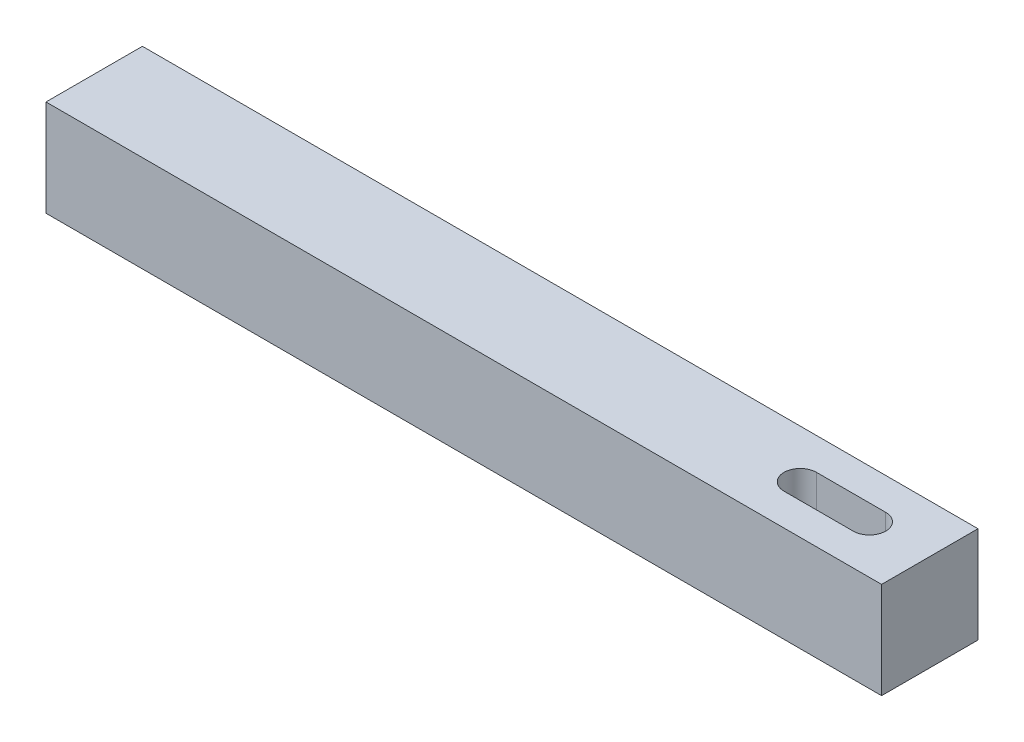
ISO-10303-21;
HEADER;
FILE_DESCRIPTION(('STEP AP214'),'2;1');
FILE_NAME('part.step','',(''),(''),'','','');
FILE_SCHEMA(('AUTOMOTIVE_DESIGN { 1 0 10303 214 1 1 1 1 }'));
ENDSEC;
DATA;
#1=APPLICATION_CONTEXT('core data for automotive mechanical design processes');
#2=APPLICATION_PROTOCOL_DEFINITION('international standard','automotive_design',2000,#1);
#3=PRODUCT_CONTEXT('',#1,'mechanical');
#4=PRODUCT('Part','Part','',(#3));
#5=PRODUCT_RELATED_PRODUCT_CATEGORY('part','',(#4));
#6=PRODUCT_DEFINITION_FORMATION('','',#4);
#7=PRODUCT_DEFINITION_CONTEXT('part definition',#1,'design');
#8=PRODUCT_DEFINITION('design','',#6,#7);
#9=PRODUCT_DEFINITION_SHAPE('','',#8);
#10=(LENGTH_UNIT() NAMED_UNIT(*) SI_UNIT(.MILLI.,.METRE.));
#11=(NAMED_UNIT(*) PLANE_ANGLE_UNIT() SI_UNIT($,.RADIAN.));
#12=(NAMED_UNIT(*) SI_UNIT($,.STERADIAN.) SOLID_ANGLE_UNIT());
#13=UNCERTAINTY_MEASURE_WITH_UNIT(LENGTH_MEASURE(1.E-05),#10,'distance_accuracy_value','');
#14=(GEOMETRIC_REPRESENTATION_CONTEXT(3) GLOBAL_UNCERTAINTY_ASSIGNED_CONTEXT((#13)) GLOBAL_UNIT_ASSIGNED_CONTEXT((#10,
#11,#12)) REPRESENTATION_CONTEXT('',''));
#15=CARTESIAN_POINT('',(0.,0.,0.));
#16=DIRECTION('',(0.,0.,1.));
#17=DIRECTION('',(1.,0.,0.));
#18=AXIS2_PLACEMENT_3D('',#15,#16,#17);
#19=CARTESIAN_POINT('',(65.,-7.5,7.5));
#20=DIRECTION('',(0.,0.,-1.));
#21=DIRECTION('',(-1.,0.,0.));
#22=AXIS2_PLACEMENT_3D('',#19,#20,#21);
#23=PLANE('',#22);
#24=DIRECTION('',(0.,-1.,0.));
#25=VECTOR('',#24,1.);
#26=CARTESIAN_POINT('',(-65.,-7.5,7.5));
#27=LINE('',#26,#25);
#28=CARTESIAN_POINT('',(-65.,7.5,7.5));
#29=VERTEX_POINT('',#28);
#30=CARTESIAN_POINT('',(-65.,-7.5,7.5));
#31=VERTEX_POINT('',#30);
#32=EDGE_CURVE('E130',#29,#31,#27,.T.);
#33=ORIENTED_EDGE('',*,*,#32,.T.);
#34=DIRECTION('',(-1.,0.,0.));
#35=VECTOR('',#34,1.);
#36=CARTESIAN_POINT('',(65.,-7.5,7.5));
#37=LINE('',#36,#35);
#38=CARTESIAN_POINT('',(65.,-7.5,7.5));
#39=VERTEX_POINT('',#38);
#40=EDGE_CURVE('E11',#39,#31,#37,.T.);
#41=ORIENTED_EDGE('',*,*,#40,.F.);
#42=DIRECTION('',(0.,-1.,0.));
#43=VECTOR('',#42,1.);
#44=CARTESIAN_POINT('',(65.,-7.5,7.5));
#45=LINE('',#44,#43);
#46=CARTESIAN_POINT('',(65.,7.5,7.5));
#47=VERTEX_POINT('',#46);
#48=EDGE_CURVE('E134',#47,#39,#45,.T.);
#49=ORIENTED_EDGE('',*,*,#48,.F.);
#50=DIRECTION('',(-1.,0.,0.));
#51=VECTOR('',#50,1.);
#52=CARTESIAN_POINT('',(65.,7.5,7.5));
#53=LINE('',#52,#51);
#54=EDGE_CURVE('E144',#47,#29,#53,.T.);
#55=ORIENTED_EDGE('',*,*,#54,.T.);
#56=EDGE_LOOP('',(#33,#41,#49,#55));
#57=FACE_BOUND('',#56,.T.);
#58=ADVANCED_FACE('F33',(#57),#23,.F.);
#59=CARTESIAN_POINT('',(65.,-7.5,-7.5));
#60=DIRECTION('',(0.,1.,0.));
#61=DIRECTION('',(0.,0.,1.));
#62=AXIS2_PLACEMENT_3D('',#59,#60,#61);
#63=PLANE('',#62);
#64=DIRECTION('',(1.,0.,0.));
#65=VECTOR('',#64,1.);
#66=CARTESIAN_POINT('',(44.8471294282881,-7.5,-2.53179537542581));
#67=LINE('',#66,#65);
#68=CARTESIAN_POINT('',(44.8471294282881,-7.5,-2.53179537542581));
#69=VERTEX_POINT('',#68);
#70=CARTESIAN_POINT('',(55.6140295245666,-7.5,-2.53179537542587));
#71=VERTEX_POINT('',#70);
#72=EDGE_CURVE('E124',#69,#71,#67,.T.);
#73=ORIENTED_EDGE('',*,*,#72,.F.);
#74=CARTESIAN_POINT('',(44.8471294282881,-7.5,1.94085741402061E-13));
#75=DIRECTION('',(0.,-1.,0.));
#76=DIRECTION('',(0.,0.,-1.));
#77=AXIS2_PLACEMENT_3D('',#74,#75,#76);
#78=CIRCLE('',#77,2.53179537542601);
#79=CARTESIAN_POINT('',(44.8471294282881,-7.5,2.5317953754262));
#80=VERTEX_POINT('',#79);
#81=EDGE_CURVE('E47',#80,#69,#78,.T.);
#82=ORIENTED_EDGE('',*,*,#81,.F.);
#83=DIRECTION('',(-1.,0.,0.));
#84=VECTOR('',#83,1.);
#85=CARTESIAN_POINT('',(44.8471294282881,-7.5,2.5317953754262));
#86=LINE('',#85,#84);
#87=CARTESIAN_POINT('',(55.6140295245666,-7.5,2.53179537542615));
#88=VERTEX_POINT('',#87);
#89=EDGE_CURVE('E115',#88,#80,#86,.T.);
#90=ORIENTED_EDGE('',*,*,#89,.F.);
#91=CARTESIAN_POINT('',(55.6140295245666,-7.5,1.37476835471162E-13));
#92=DIRECTION('',(0.,-1.,0.));
#93=DIRECTION('',(0.,0.,-1.));
#94=AXIS2_PLACEMENT_3D('',#91,#92,#93);
#95=CIRCLE('',#94,2.53179537542601);
#96=EDGE_CURVE('E118',#71,#88,#95,.T.);
#97=ORIENTED_EDGE('',*,*,#96,.F.);
#98=EDGE_LOOP('',(#73,#82,#90,#97));
#99=FACE_BOUND('',#98,.T.);
#100=DIRECTION('',(0.,0.,-1.));
#101=VECTOR('',#100,1.);
#102=CARTESIAN_POINT('',(-65.,-7.5,-7.5));
#103=LINE('',#102,#101);
#104=CARTESIAN_POINT('',(-65.,-7.5,-7.5));
#105=VERTEX_POINT('',#104);
#106=EDGE_CURVE('E147',#31,#105,#103,.T.);
#107=ORIENTED_EDGE('',*,*,#106,.T.);
#108=DIRECTION('',(-1.,0.,0.));
#109=VECTOR('',#108,1.);
#110=CARTESIAN_POINT('',(65.,-7.5,-7.5));
#111=LINE('',#110,#109);
#112=CARTESIAN_POINT('',(65.,-7.5,-7.5));
#113=VERTEX_POINT('',#112);
#114=EDGE_CURVE('E40',#113,#105,#111,.T.);
#115=ORIENTED_EDGE('',*,*,#114,.F.);
#116=DIRECTION('',(0.,0.,-1.));
#117=VECTOR('',#116,1.);
#118=CARTESIAN_POINT('',(65.,-7.5,-7.5));
#119=LINE('',#118,#117);
#120=EDGE_CURVE('E137',#39,#113,#119,.T.);
#121=ORIENTED_EDGE('',*,*,#120,.F.);
#122=ORIENTED_EDGE('',*,*,#40,.T.);
#123=EDGE_LOOP('',(#107,#115,#121,#122));
#124=FACE_BOUND('',#123,.T.);
#125=ADVANCED_FACE('F175',(#99,#124),#63,.F.);
#126=CARTESIAN_POINT('',(65.,-7.5,-7.5));
#127=DIRECTION('',(0.,0.,1.));
#128=DIRECTION('',(0.,-1.,0.));
#129=AXIS2_PLACEMENT_3D('',#126,#127,#128);
#130=PLANE('',#129);
#131=DIRECTION('',(0.,1.,0.));
#132=VECTOR('',#131,1.);
#133=CARTESIAN_POINT('',(-65.,-7.5,-7.5));
#134=LINE('',#133,#132);
#135=CARTESIAN_POINT('',(-65.,7.5,-7.5));
#136=VERTEX_POINT('',#135);
#137=EDGE_CURVE('E149',#105,#136,#134,.T.);
#138=ORIENTED_EDGE('',*,*,#137,.T.);
#139=DIRECTION('',(-1.,0.,0.));
#140=VECTOR('',#139,1.);
#141=CARTESIAN_POINT('',(65.,7.5,-7.5));
#142=LINE('',#141,#140);
#143=CARTESIAN_POINT('',(65.,7.5,-7.5));
#144=VERTEX_POINT('',#143);
#145=EDGE_CURVE('E154',#144,#136,#142,.T.);
#146=ORIENTED_EDGE('',*,*,#145,.F.);
#147=DIRECTION('',(0.,1.,0.));
#148=VECTOR('',#147,1.);
#149=CARTESIAN_POINT('',(65.,-7.5,-7.5));
#150=LINE('',#149,#148);
#151=EDGE_CURVE('E140',#113,#144,#150,.T.);
#152=ORIENTED_EDGE('',*,*,#151,.F.);
#153=ORIENTED_EDGE('',*,*,#114,.T.);
#154=EDGE_LOOP('',(#138,#146,#152,#153));
#155=FACE_BOUND('',#154,.T.);
#156=ADVANCED_FACE('F161',(#155),#130,.F.);
#157=CARTESIAN_POINT('',(65.,7.5,-7.5));
#158=DIRECTION('',(0.,-1.,0.));
#159=DIRECTION('',(0.,0.,-1.));
#160=AXIS2_PLACEMENT_3D('',#157,#158,#159);
#161=PLANE('',#160);
#162=DIRECTION('',(-1.,0.,0.));
#163=VECTOR('',#162,1.);
#164=CARTESIAN_POINT('',(44.8471294282881,7.5,2.5317953754262));
#165=LINE('',#164,#163);
#166=CARTESIAN_POINT('',(55.6140295245666,7.5,2.53179537542615));
#167=VERTEX_POINT('',#166);
#168=CARTESIAN_POINT('',(44.8471294282881,7.5,2.5317953754262));
#169=VERTEX_POINT('',#168);
#170=EDGE_CURVE('E105',#167,#169,#165,.T.);
#171=ORIENTED_EDGE('',*,*,#170,.T.);
#172=CARTESIAN_POINT('',(44.8471294282881,7.5,1.95820464878038E-13));
#173=DIRECTION('',(0.,-1.,0.));
#174=DIRECTION('',(0.,0.,-1.));
#175=AXIS2_PLACEMENT_3D('',#172,#173,#174);
#176=CIRCLE('',#175,2.53179537542601);
#177=CARTESIAN_POINT('',(44.8471294282881,7.5,-2.53179537542581));
#178=VERTEX_POINT('',#177);
#179=EDGE_CURVE('E99',#169,#178,#176,.T.);
#180=ORIENTED_EDGE('',*,*,#179,.T.);
#181=DIRECTION('',(1.,0.,0.));
#182=VECTOR('',#181,1.);
#183=CARTESIAN_POINT('',(44.8471294282881,7.5,-2.53179537542581));
#184=LINE('',#183,#182);
#185=CARTESIAN_POINT('',(55.6140295245666,7.5,-2.53179537542587));
#186=VERTEX_POINT('',#185);
#187=EDGE_CURVE('E108',#178,#186,#184,.T.);
#188=ORIENTED_EDGE('',*,*,#187,.T.);
#189=CARTESIAN_POINT('',(55.6140295245666,7.5,1.39211558947139E-13));
#190=DIRECTION('',(0.,-1.,0.));
#191=DIRECTION('',(0.,0.,-1.));
#192=AXIS2_PLACEMENT_3D('',#189,#190,#191);
#193=CIRCLE('',#192,2.53179537542601);
#194=EDGE_CURVE('E55',#186,#167,#193,.T.);
#195=ORIENTED_EDGE('',*,*,#194,.T.);
#196=EDGE_LOOP('',(#171,#180,#188,#195));
#197=FACE_BOUND('',#196,.T.);
#198=DIRECTION('',(0.,0.,1.));
#199=VECTOR('',#198,1.);
#200=CARTESIAN_POINT('',(-65.,7.5,-7.5));
#201=LINE('',#200,#199);
#202=EDGE_CURVE('E138',#136,#29,#201,.T.);
#203=ORIENTED_EDGE('',*,*,#202,.T.);
#204=ORIENTED_EDGE('',*,*,#54,.F.);
#205=DIRECTION('',(0.,0.,1.));
#206=VECTOR('',#205,1.);
#207=CARTESIAN_POINT('',(65.,7.5,-7.5));
#208=LINE('',#207,#206);
#209=EDGE_CURVE('E142',#144,#47,#208,.T.);
#210=ORIENTED_EDGE('',*,*,#209,.F.);
#211=ORIENTED_EDGE('',*,*,#145,.T.);
#212=EDGE_LOOP('',(#203,#204,#210,#211));
#213=FACE_BOUND('',#212,.T.);
#214=ADVANCED_FACE('F112',(#197,#213),#161,.F.);
#215=CARTESIAN_POINT('',(65.,0.,0.));
#216=DIRECTION('',(1.,0.,0.));
#217=DIRECTION('',(0.,0.,-1.));
#218=AXIS2_PLACEMENT_3D('',#215,#216,#217);
#219=PLANE('',#218);
#220=ORIENTED_EDGE('',*,*,#48,.T.);
#221=ORIENTED_EDGE('',*,*,#120,.T.);
#222=ORIENTED_EDGE('',*,*,#151,.T.);
#223=ORIENTED_EDGE('',*,*,#209,.T.);
#224=EDGE_LOOP('',(#220,#221,#222,#223));
#225=FACE_BOUND('',#224,.T.);
#226=ADVANCED_FACE('F174',(#225),#219,.T.);
#227=CARTESIAN_POINT('',(-65.,0.,0.));
#228=DIRECTION('',(1.,0.,0.));
#229=DIRECTION('',(0.,0.,-1.));
#230=AXIS2_PLACEMENT_3D('',#227,#228,#229);
#231=PLANE('',#230);
#232=ORIENTED_EDGE('',*,*,#32,.F.);
#233=ORIENTED_EDGE('',*,*,#202,.F.);
#234=ORIENTED_EDGE('',*,*,#137,.F.);
#235=ORIENTED_EDGE('',*,*,#106,.F.);
#236=EDGE_LOOP('',(#232,#233,#234,#235));
#237=FACE_BOUND('',#236,.T.);
#238=ADVANCED_FACE('F167',(#237),#231,.F.);
#239=CARTESIAN_POINT('',(44.8471294282881,7.5,1.95820464878038E-13));
#240=DIRECTION('',(0.,-1.,0.));
#241=DIRECTION('',(0.,0.,-1.));
#242=AXIS2_PLACEMENT_3D('',#239,#240,#241);
#243=CYLINDRICAL_SURFACE('',#242,2.53179537542601);
#244=ORIENTED_EDGE('',*,*,#81,.T.);
#245=DIRECTION('',(0.,-1.,0.));
#246=VECTOR('',#245,1.);
#247=CARTESIAN_POINT('',(44.8471294282881,7.5,-2.53179537542581));
#248=LINE('',#247,#246);
#249=EDGE_CURVE('E95',#178,#69,#248,.T.);
#250=ORIENTED_EDGE('',*,*,#249,.F.);
#251=ORIENTED_EDGE('',*,*,#179,.F.);
#252=DIRECTION('',(0.,-1.,0.));
#253=VECTOR('',#252,1.);
#254=CARTESIAN_POINT('',(44.8471294282881,7.5,2.5317953754262));
#255=LINE('',#254,#253);
#256=EDGE_CURVE('E128',#169,#80,#255,.T.);
#257=ORIENTED_EDGE('',*,*,#256,.T.);
#258=EDGE_LOOP('',(#244,#250,#251,#257));
#259=FACE_BOUND('',#258,.T.);
#260=ADVANCED_FACE('F97',(#259),#243,.F.);
#261=CARTESIAN_POINT('',(44.8471294282881,7.5,2.5317953754262));
#262=DIRECTION('',(0.,0.,1.));
#263=DIRECTION('',(1.,0.,0.));
#264=AXIS2_PLACEMENT_3D('',#261,#262,#263);
#265=PLANE('',#264);
#266=ORIENTED_EDGE('',*,*,#89,.T.);
#267=ORIENTED_EDGE('',*,*,#256,.F.);
#268=ORIENTED_EDGE('',*,*,#170,.F.);
#269=DIRECTION('',(0.,-1.,0.));
#270=VECTOR('',#269,1.);
#271=CARTESIAN_POINT('',(55.6140295245666,7.5,2.53179537542615));
#272=LINE('',#271,#270);
#273=EDGE_CURVE('E131',#167,#88,#272,.T.);
#274=ORIENTED_EDGE('',*,*,#273,.T.);
#275=EDGE_LOOP('',(#266,#267,#268,#274));
#276=FACE_BOUND('',#275,.T.);
#277=ADVANCED_FACE('F193',(#276),#265,.F.);
#278=CARTESIAN_POINT('',(55.6140295245666,7.5,1.39211558947139E-13));
#279=DIRECTION('',(0.,-1.,0.));
#280=DIRECTION('',(0.,0.,-1.));
#281=AXIS2_PLACEMENT_3D('',#278,#279,#280);
#282=CYLINDRICAL_SURFACE('',#281,2.53179537542601);
#283=ORIENTED_EDGE('',*,*,#96,.T.);
#284=ORIENTED_EDGE('',*,*,#273,.F.);
#285=ORIENTED_EDGE('',*,*,#194,.F.);
#286=DIRECTION('',(0.,-1.,0.));
#287=VECTOR('',#286,1.);
#288=CARTESIAN_POINT('',(55.6140295245666,7.5,-2.53179537542587));
#289=LINE('',#288,#287);
#290=EDGE_CURVE('E104',#186,#71,#289,.T.);
#291=ORIENTED_EDGE('',*,*,#290,.T.);
#292=EDGE_LOOP('',(#283,#284,#285,#291));
#293=FACE_BOUND('',#292,.T.);
#294=ADVANCED_FACE('F196',(#293),#282,.F.);
#295=CARTESIAN_POINT('',(44.8471294282881,7.5,-2.53179537542581));
#296=DIRECTION('',(0.,0.,-1.));
#297=DIRECTION('',(-1.,0.,0.));
#298=AXIS2_PLACEMENT_3D('',#295,#296,#297);
#299=PLANE('',#298);
#300=ORIENTED_EDGE('',*,*,#72,.T.);
#301=ORIENTED_EDGE('',*,*,#290,.F.);
#302=ORIENTED_EDGE('',*,*,#187,.F.);
#303=ORIENTED_EDGE('',*,*,#249,.T.);
#304=EDGE_LOOP('',(#300,#301,#302,#303));
#305=FACE_BOUND('',#304,.T.);
#306=ADVANCED_FACE('F109',(#305),#299,.F.);
#307=CLOSED_SHELL('',(#58,#125,#156,#214,#226,#238,#260,#277,#294,#306));
#308=MANIFOLD_SOLID_BREP('B2',#307);
#309=ADVANCED_BREP_SHAPE_REPRESENTATION('',(#18,#308),#14);
#310=SHAPE_DEFINITION_REPRESENTATION(#9,#309);
ENDSEC;
END-ISO-10303-21;
